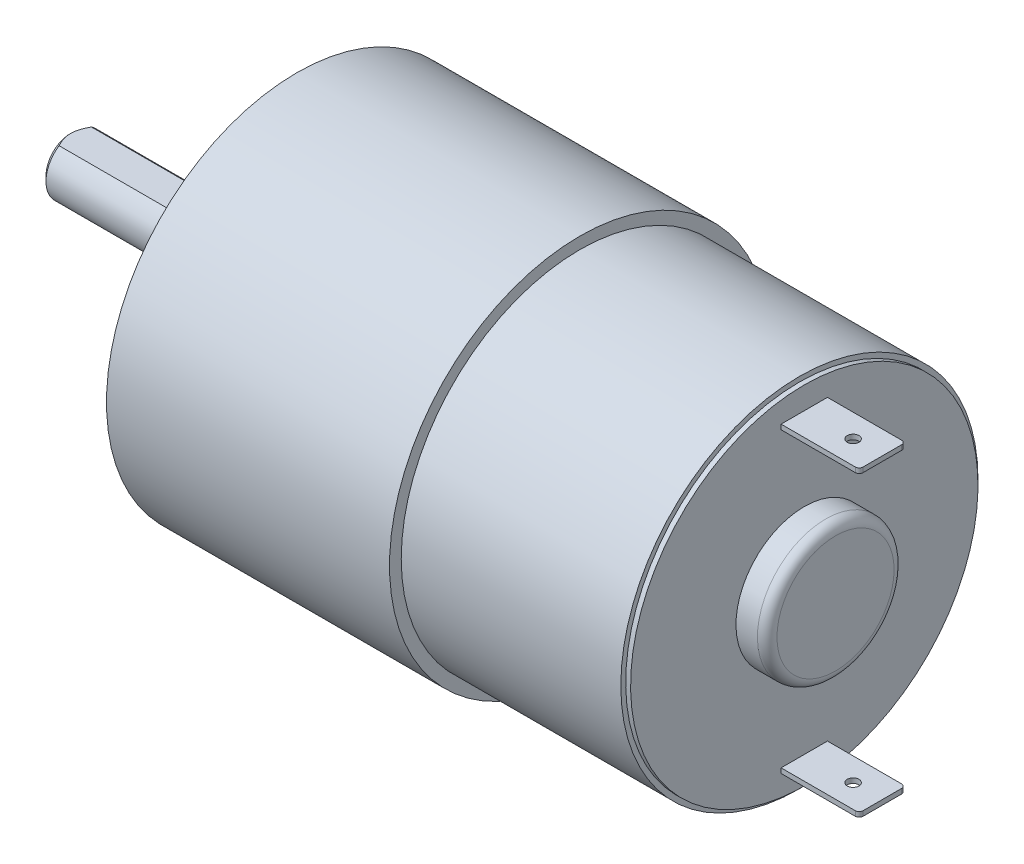
ISO-10303-21;
HEADER;
FILE_DESCRIPTION(('STEP AP214'),'2;1');
FILE_NAME('part.step','',(''),(''),'','','');
FILE_SCHEMA(('AUTOMOTIVE_DESIGN { 1 0 10303 214 1 1 1 1 }'));
ENDSEC;
DATA;
#1=APPLICATION_CONTEXT('core data for automotive mechanical design processes');
#2=APPLICATION_PROTOCOL_DEFINITION('international standard','automotive_design',2000,#1);
#3=PRODUCT_CONTEXT('',#1,'mechanical');
#4=PRODUCT('Part','Part','',(#3));
#5=PRODUCT_RELATED_PRODUCT_CATEGORY('part','',(#4));
#6=PRODUCT_DEFINITION_FORMATION('','',#4);
#7=PRODUCT_DEFINITION_CONTEXT('part definition',#1,'design');
#8=PRODUCT_DEFINITION('design','',#6,#7);
#9=PRODUCT_DEFINITION_SHAPE('','',#8);
#10=(LENGTH_UNIT() NAMED_UNIT(*) SI_UNIT(.MILLI.,.METRE.));
#11=(NAMED_UNIT(*) PLANE_ANGLE_UNIT() SI_UNIT($,.RADIAN.));
#12=(NAMED_UNIT(*) SI_UNIT($,.STERADIAN.) SOLID_ANGLE_UNIT());
#13=UNCERTAINTY_MEASURE_WITH_UNIT(LENGTH_MEASURE(1.E-05),#10,'distance_accuracy_value','');
#14=(GEOMETRIC_REPRESENTATION_CONTEXT(3) GLOBAL_UNCERTAINTY_ASSIGNED_CONTEXT((#13)) GLOBAL_UNIT_ASSIGNED_CONTEXT((#10,
#11,#12)) REPRESENTATION_CONTEXT('',''));
#15=CARTESIAN_POINT('',(0.,0.,0.));
#16=DIRECTION('',(0.,0.,1.));
#17=DIRECTION('',(1.,0.,0.));
#18=AXIS2_PLACEMENT_3D('',#15,#16,#17);
#19=CARTESIAN_POINT('',(0.,0.,0.));
#20=DIRECTION('',(-1.,0.,0.));
#21=DIRECTION('',(0.,-1.,0.));
#22=AXIS2_PLACEMENT_3D('',#19,#20,#21);
#23=PLANE('',#22);
#24=CARTESIAN_POINT('',(-5.6843418860808E-11,0.,0.));
#25=DIRECTION('',(1.,0.,0.));
#26=DIRECTION('',(0.,0.,-1.));
#27=AXIS2_PLACEMENT_3D('',#24,#25,#26);
#28=CIRCLE('',#27,2.50000000005457);
#29=CARTESIAN_POINT('',(-8.41271496909712E-11,2.50000000002729,0.));
#30=VERTEX_POINT('',#29);
#31=EDGE_CURVE('E171',#30,#30,#28,.T.);
#32=ORIENTED_EDGE('',*,*,#31,.F.);
#33=EDGE_LOOP('',(#32));
#34=FACE_BOUND('',#33,.T.);
#35=ADVANCED_FACE('F16',(#34),#23,.T.);
#36=CARTESIAN_POINT('',(0.49999999987449,0.,0.));
#37=DIRECTION('',(1.,0.,0.));
#38=DIRECTION('',(0.,0.,-1.));
#39=AXIS2_PLACEMENT_3D('',#36,#37,#38);
#40=CONICAL_SURFACE('',#39,2.9999999999859,0.785398163397448);
#41=CARTESIAN_POINT('',(-1.08961450973055E-10,2.49999999999409,0.));
#42=CARTESIAN_POINT('',(-6.43177486795808E-05,2.49999999999788,-0.076842839180518));
#43=CARTESIAN_POINT('',(0.00354143297495373,2.49999999999944,-0.153646619440515));
#44=CARTESIAN_POINT('',(0.0175861812727384,2.50000000000057,-0.306486913990931));
#45=CARTESIAN_POINT('',(0.028012243209482,2.50000000000015,-0.382524604614898));
#46=CARTESIAN_POINT('',(0.0549768112715763,2.49999999999985,-0.532231201598618));
#47=CARTESIAN_POINT('',(0.0714148650301511,2.49999999999996,-0.605918543015366));
#48=CARTESIAN_POINT('',(0.109672230239725,2.50000000000004,-0.751897163106947));
#49=CARTESIAN_POINT('',(0.131493639670987,2.50000000000001,-0.824187885624805));
#50=CARTESIAN_POINT('',(0.177758293321596,2.49999999999999,-0.961361204563494));
#51=CARTESIAN_POINT('',(0.201841837790338,2.5,-1.02636662587191));
#52=CARTESIAN_POINT('',(0.253302800658744,2.5,-1.1550556235711));
#53=CARTESIAN_POINT('',(0.280680360013409,2.5,-1.21873914325923));
#54=CARTESIAN_POINT('',(0.338654953810169,2.5,-1.34581351004464));
#55=CARTESIAN_POINT('',(0.369295480668299,2.5,-1.40918435965208));
#56=CARTESIAN_POINT('',(0.432964963796484,2.5,-1.53466113606442));
#57=CARTESIAN_POINT('',(0.46599220548214,2.5,-1.59676793063933));
#58=CARTESIAN_POINT('',(0.499999999913604,2.5,-1.65831239522295));
#59=B_SPLINE_CURVE_WITH_KNOTS('',3,(#41,#42,#43,#44,#45,#46,#47,#48,#49,#50,#51,#52,#53,#54,#55,
#56,#57,#58),.UNSPECIFIED.,.F.,.F.,(4,2,2,2,2,2,2,2,4),(0.,0.230381722715328,0.460327757459506,
0.686595219702922,0.912951001700784,1.12081935765768,1.32869661172609,1.53981070706892,
1.7507746202842),.UNSPECIFIED.);
#60=CARTESIAN_POINT('',(0.49999999995734,2.5,-1.65831239520128));
#61=VERTEX_POINT('',#60);
#62=EDGE_CURVE('E181',#30,#61,#59,.T.);
#63=ORIENTED_EDGE('',*,*,#62,.T.);
#64=CARTESIAN_POINT('',(0.500000000000014,0.,0.));
#65=DIRECTION('',(1.,0.,0.));
#66=DIRECTION('',(0.,1.,0.));
#67=AXIS2_PLACEMENT_3D('',#64,#65,#66);
#68=CIRCLE('',#67,3.);
#69=CARTESIAN_POINT('',(0.49999999995734,2.5,1.65831239520128));
#70=VERTEX_POINT('',#69);
#71=EDGE_CURVE('E166',#70,#61,#68,.T.);
#72=ORIENTED_EDGE('',*,*,#71,.F.);
#73=CARTESIAN_POINT('',(0.499999999925227,2.49999999997626,1.65831239521903));
#74=CARTESIAN_POINT('',(0.474979974333369,2.49999999999125,1.61304419075708));
#75=CARTESIAN_POINT('',(0.45050057269507,2.49999999999761,1.56747781755556));
#76=CARTESIAN_POINT('',(0.40279031317973,2.5000000000024,1.47571363159524));
#77=CARTESIAN_POINT('',(0.379559096032034,2.50000000000084,1.42951600538723));
#78=CARTESIAN_POINT('',(0.311766258440834,2.49999999999832,1.2894689825457));
#79=CARTESIAN_POINT('',(0.269331446407607,2.49999999999956,1.19456817299876));
#80=CARTESIAN_POINT('',(0.192835868545321,2.50000000000043,1.00435832665082));
#81=CARTESIAN_POINT('',(0.158581406665273,2.50000000000012,0.909128166895885));
#82=CARTESIAN_POINT('',(0.0988813615530537,2.49999999999989,0.715960996439603));
#83=CARTESIAN_POINT('',(0.0734294785928917,2.49999999999997,0.618025975952468));
#84=CARTESIAN_POINT('',(0.036048583753439,2.50000000000003,0.43409653106737));
#85=CARTESIAN_POINT('',(0.0227071005608561,2.50000000000001,0.348395131944211));
#86=CARTESIAN_POINT('',(0.00917334555979382,2.5,0.218706232986137));
#87=CARTESIAN_POINT('',(0.00574117932389647,2.5,0.175042274899419));
#88=CARTESIAN_POINT('',(0.00115154514745591,2.5,0.0875881850281385));
#89=CARTESIAN_POINT('',(-5.55031791566704E-06,2.5,0.0437980337582923));
#90=CARTESIAN_POINT('',(-1.11410880521134E-10,2.5,4.96130914129367E-13));
#91=B_SPLINE_CURVE_WITH_KNOTS('',3,(#73,#74,#75,#76,#77,#78,#79,#80,#81,#82,#83,#84,#85,#86,#87,
#88,#89,#90),.UNSPECIFIED.,.F.,.F.,(4,2,2,2,2,2,2,2,4),(0.,0.155160114664255,0.310275326959197,
0.621889187477608,0.925164565319454,1.22822244722021,1.48798349656647,1.61932602452163,
1.75069005411929),.UNSPECIFIED.);
#92=EDGE_CURVE('E174',#70,#30,#91,.T.);
#93=ORIENTED_EDGE('',*,*,#92,.T.);
#94=ORIENTED_EDGE('',*,*,#31,.T.);
#95=EDGE_LOOP('',(#63,#72,#93,#94));
#96=FACE_BOUND('',#95,.T.);
#97=ADVANCED_FACE('F176',(#96),#40,.T.);
#98=CARTESIAN_POINT('',(12.,2.5,-1.65831239517769));
#99=DIRECTION('',(0.,-1.,0.));
#100=DIRECTION('',(1.,0.,0.));
#101=AXIS2_PLACEMENT_3D('',#98,#99,#100);
#102=PLANE('',#101);
#103=ORIENTED_EDGE('',*,*,#62,.F.);
#104=ORIENTED_EDGE('',*,*,#92,.F.);
#105=DIRECTION('',(1.,0.,0.));
#106=VECTOR('',#105,1.);
#107=CARTESIAN_POINT('',(78.4,2.5,1.65831239517769));
#108=LINE('',#107,#106);
#109=CARTESIAN_POINT('',(12.,2.5,1.65831239517768));
#110=VERTEX_POINT('',#109);
#111=EDGE_CURVE('E413',#110,#70,#108,.F.);
#112=ORIENTED_EDGE('',*,*,#111,.F.);
#113=DIRECTION('',(0.,0.,1.));
#114=VECTOR('',#113,1.);
#115=CARTESIAN_POINT('',(12.,2.5,0.));
#116=LINE('',#115,#114);
#117=CARTESIAN_POINT('',(12.,2.5,-1.65831239517769));
#118=VERTEX_POINT('',#117);
#119=EDGE_CURVE('E186',#110,#118,#116,.F.);
#120=ORIENTED_EDGE('',*,*,#119,.T.);
#121=DIRECTION('',(1.,0.,0.));
#122=VECTOR('',#121,1.);
#123=CARTESIAN_POINT('',(78.4,2.5,-1.65831239517769));
#124=LINE('',#123,#122);
#125=EDGE_CURVE('E414',#61,#118,#124,.T.);
#126=ORIENTED_EDGE('',*,*,#125,.F.);
#127=EDGE_LOOP('',(#103,#104,#112,#120,#126));
#128=FACE_BOUND('',#127,.T.);
#129=ADVANCED_FACE('F198',(#128),#102,.F.);
#130=CARTESIAN_POINT('',(12.,0.,0.));
#131=DIRECTION('',(1.,0.,0.));
#132=DIRECTION('',(0.,1.,0.));
#133=AXIS2_PLACEMENT_3D('',#130,#131,#132);
#134=PLANE('',#133);
#135=CARTESIAN_POINT('',(12.,0.,0.));
#136=DIRECTION('',(1.,0.,0.));
#137=DIRECTION('',(0.,1.,0.));
#138=AXIS2_PLACEMENT_3D('',#135,#136,#137);
#139=CIRCLE('',#138,3.);
#140=EDGE_CURVE('E418',#118,#110,#139,.T.);
#141=ORIENTED_EDGE('',*,*,#140,.F.);
#142=ORIENTED_EDGE('',*,*,#119,.F.);
#143=EDGE_LOOP('',(#141,#142));
#144=FACE_BOUND('',#143,.T.);
#145=ADVANCED_FACE('F209',(#144),#134,.F.);
#146=CARTESIAN_POINT('',(78.4,0.,0.));
#147=DIRECTION('',(1.,0.,0.));
#148=DIRECTION('',(0.,1.,0.));
#149=AXIS2_PLACEMENT_3D('',#146,#147,#148);
#150=CYLINDRICAL_SURFACE('',#149,3.);
#151=ORIENTED_EDGE('',*,*,#111,.T.);
#152=ORIENTED_EDGE('',*,*,#71,.T.);
#153=ORIENTED_EDGE('',*,*,#125,.T.);
#154=ORIENTED_EDGE('',*,*,#140,.T.);
#155=EDGE_LOOP('',(#151,#152,#153,#154));
#156=FACE_BOUND('',#155,.T.);
#157=CARTESIAN_POINT('',(15.,0.,0.));
#158=DIRECTION('',(1.,0.,0.));
#159=DIRECTION('',(0.,1.,0.));
#160=AXIS2_PLACEMENT_3D('',#157,#158,#159);
#161=CIRCLE('',#160,3.);
#162=CARTESIAN_POINT('',(15.,3.,0.));
#163=VERTEX_POINT('',#162);
#164=EDGE_CURVE('E539',#163,#163,#161,.T.);
#165=ORIENTED_EDGE('',*,*,#164,.F.);
#166=EDGE_LOOP('',(#165));
#167=FACE_BOUND('',#166,.T.);
#168=ADVANCED_FACE('F391',(#156,#167),#150,.T.);
#169=CARTESIAN_POINT('',(78.4,6.99999999999999,0.));
#170=DIRECTION('',(1.,0.,0.));
#171=DIRECTION('',(0.,1.,0.));
#172=AXIS2_PLACEMENT_3D('',#169,#170,#171);
#173=PLANE('',#172);
#174=CARTESIAN_POINT('',(78.4,0.,0.));
#175=DIRECTION('',(-1.,0.,0.));
#176=DIRECTION('',(0.,-1.,0.));
#177=AXIS2_PLACEMENT_3D('',#174,#175,#176);
#178=CIRCLE('',#177,6.00000000000001);
#179=CARTESIAN_POINT('',(78.4,-6.00000000000001,0.));
#180=VERTEX_POINT('',#179);
#181=CARTESIAN_POINT('',(78.4,6.00000000000001,0.));
#182=VERTEX_POINT('',#181);
#183=EDGE_CURVE('E376',#180,#182,#178,.T.);
#184=ORIENTED_EDGE('',*,*,#183,.F.);
#185=CARTESIAN_POINT('',(78.4,0.,0.));
#186=DIRECTION('',(-1.,0.,0.));
#187=DIRECTION('',(0.,1.,0.));
#188=AXIS2_PLACEMENT_3D('',#185,#186,#187);
#189=CIRCLE('',#188,6.00000000000001);
#190=EDGE_CURVE('E402',#182,#180,#189,.T.);
#191=ORIENTED_EDGE('',*,*,#190,.F.);
#192=EDGE_LOOP('',(#184,#191));
#193=FACE_BOUND('',#192,.T.);
#194=ADVANCED_FACE('F382',(#193),#173,.T.);
#195=CARTESIAN_POINT('',(15.,2.99999999999999,0.));
#196=DIRECTION('',(-1.,0.,0.));
#197=DIRECTION('',(0.,-1.,0.));
#198=AXIS2_PLACEMENT_3D('',#195,#196,#197);
#199=PLANE('',#198);
#200=CARTESIAN_POINT('',(15.,0.,0.));
#201=DIRECTION('',(1.,0.,0.));
#202=DIRECTION('',(0.,1.,0.));
#203=AXIS2_PLACEMENT_3D('',#200,#201,#202);
#204=CIRCLE('',#203,5.99999999999999);
#205=CARTESIAN_POINT('',(15.,5.99999999999999,0.));
#206=VERTEX_POINT('',#205);
#207=EDGE_CURVE('E372',#206,#206,#204,.T.);
#208=ORIENTED_EDGE('',*,*,#207,.F.);
#209=EDGE_LOOP('',(#208));
#210=FACE_BOUND('',#209,.T.);
#211=ORIENTED_EDGE('',*,*,#164,.T.);
#212=EDGE_LOOP('',(#211));
#213=FACE_BOUND('',#212,.T.);
#214=ADVANCED_FACE('F357',(#210,#213),#199,.T.);
#215=CARTESIAN_POINT('',(77.4,0.,0.));
#216=DIRECTION('',(1.,0.,0.));
#217=DIRECTION('',(0.,1.,0.));
#218=AXIS2_PLACEMENT_3D('',#215,#216,#217);
#219=TOROIDAL_SURFACE('',#218,6.00000000000001,1.);
#220=CARTESIAN_POINT('',(77.4,0.,0.));
#221=DIRECTION('',(1.,0.,0.));
#222=DIRECTION('',(0.,1.,0.));
#223=AXIS2_PLACEMENT_3D('',#220,#221,#222);
#224=CIRCLE('',#223,7.);
#225=CARTESIAN_POINT('',(77.4,7.,0.));
#226=VERTEX_POINT('',#225);
#227=EDGE_CURVE('E367',#226,#226,#224,.F.);
#228=ORIENTED_EDGE('',*,*,#227,.F.);
#229=EDGE_LOOP('',(#228));
#230=FACE_BOUND('',#229,.T.);
#231=ORIENTED_EDGE('',*,*,#190,.T.);
#232=ORIENTED_EDGE('',*,*,#183,.T.);
#233=EDGE_LOOP('',(#231,#232));
#234=FACE_BOUND('',#233,.T.);
#235=ADVANCED_FACE('F351',(#230,#234),#219,.T.);
#236=CARTESIAN_POINT('',(80.2,-19.5,0.));
#237=DIRECTION('',(0.,1.,0.));
#238=DIRECTION('',(-1.,0.,0.));
#239=AXIS2_PLACEMENT_3D('',#236,#237,#238);
#240=CYLINDRICAL_SURFACE('',#239,0.600000000000003);
#241=CARTESIAN_POINT('',(80.2,15.,0.));
#242=DIRECTION('',(0.,1.,0.));
#243=DIRECTION('',(-1.,0.,0.));
#244=AXIS2_PLACEMENT_3D('',#241,#242,#243);
#245=CIRCLE('',#244,0.600000000000003);
#246=CARTESIAN_POINT('',(79.6,15.,0.));
#247=VERTEX_POINT('',#246);
#248=EDGE_CURVE('E371',#247,#247,#245,.F.);
#249=ORIENTED_EDGE('',*,*,#248,.T.);
#250=EDGE_LOOP('',(#249));
#251=FACE_BOUND('',#250,.T.);
#252=CARTESIAN_POINT('',(80.2,15.5,0.));
#253=DIRECTION('',(0.,1.,0.));
#254=DIRECTION('',(-1.,0.,0.));
#255=AXIS2_PLACEMENT_3D('',#252,#253,#254);
#256=CIRCLE('',#255,0.600000000000003);
#257=CARTESIAN_POINT('',(79.6,15.5,0.));
#258=VERTEX_POINT('',#257);
#259=EDGE_CURVE('E518',#258,#258,#256,.T.);
#260=ORIENTED_EDGE('',*,*,#259,.T.);
#261=EDGE_LOOP('',(#260));
#262=FACE_BOUND('',#261,.T.);
#263=ADVANCED_FACE('F348',(#251,#262),#240,.F.);
#264=CARTESIAN_POINT('',(82.8,0.,1.97499999999999));
#265=DIRECTION('',(0.,1.,0.));
#266=DIRECTION('',(0.,0.,1.));
#267=AXIS2_PLACEMENT_3D('',#264,#265,#266);
#268=CYLINDRICAL_SURFACE('',#267,0.4);
#269=CARTESIAN_POINT('',(82.8,15.,1.975));
#270=DIRECTION('',(0.,1.,0.));
#271=DIRECTION('',(0.,0.,1.));
#272=AXIS2_PLACEMENT_3D('',#269,#270,#271);
#273=CIRCLE('',#272,0.4);
#274=CARTESIAN_POINT('',(82.8,15.,2.375));
#275=VERTEX_POINT('',#274);
#276=CARTESIAN_POINT('',(83.2,15.,1.975));
#277=VERTEX_POINT('',#276);
#278=EDGE_CURVE('E528',#275,#277,#273,.T.);
#279=ORIENTED_EDGE('',*,*,#278,.T.);
#280=DIRECTION('',(0.,1.,0.));
#281=VECTOR('',#280,1.);
#282=CARTESIAN_POINT('',(83.2,0.,1.975));
#283=LINE('',#282,#281);
#284=CARTESIAN_POINT('',(83.2,15.5,1.975));
#285=VERTEX_POINT('',#284);
#286=EDGE_CURVE('E822',#285,#277,#283,.F.);
#287=ORIENTED_EDGE('',*,*,#286,.F.);
#288=CARTESIAN_POINT('',(82.8,15.5,1.975));
#289=DIRECTION('',(0.,1.,0.));
#290=DIRECTION('',(0.,0.,1.));
#291=AXIS2_PLACEMENT_3D('',#288,#289,#290);
#292=CIRCLE('',#291,0.4);
#293=CARTESIAN_POINT('',(82.8,15.5,2.375));
#294=VERTEX_POINT('',#293);
#295=EDGE_CURVE('E514',#285,#294,#292,.F.);
#296=ORIENTED_EDGE('',*,*,#295,.T.);
#297=DIRECTION('',(0.,1.,0.));
#298=VECTOR('',#297,1.);
#299=CARTESIAN_POINT('',(82.8,15.5,2.375));
#300=LINE('',#299,#298);
#301=EDGE_CURVE('E888',#294,#275,#300,.F.);
#302=ORIENTED_EDGE('',*,*,#301,.T.);
#303=EDGE_LOOP('',(#279,#287,#296,#302));
#304=FACE_BOUND('',#303,.T.);
#305=ADVANCED_FACE('F344',(#304),#268,.T.);
#306=CARTESIAN_POINT('',(83.2,15.5,2.375));
#307=DIRECTION('',(0.,0.,-1.));
#308=DIRECTION('',(0.,1.,0.));
#309=AXIS2_PLACEMENT_3D('',#306,#307,#308);
#310=PLANE('',#309);
#311=ORIENTED_EDGE('',*,*,#301,.F.);
#312=DIRECTION('',(1.,0.,0.));
#313=VECTOR('',#312,1.);
#314=CARTESIAN_POINT('',(83.2,15.5,2.375));
#315=LINE('',#314,#313);
#316=CARTESIAN_POINT('',(75.2,15.5,2.375));
#317=VERTEX_POINT('',#316);
#318=EDGE_CURVE('E517',#294,#317,#315,.F.);
#319=ORIENTED_EDGE('',*,*,#318,.T.);
#320=DIRECTION('',(0.,1.,0.));
#321=VECTOR('',#320,1.);
#322=CARTESIAN_POINT('',(75.2,15.5,2.375));
#323=LINE('',#322,#321);
#324=CARTESIAN_POINT('',(75.2,15.,2.375));
#325=VERTEX_POINT('',#324);
#326=EDGE_CURVE('E898',#325,#317,#323,.T.);
#327=ORIENTED_EDGE('',*,*,#326,.F.);
#328=DIRECTION('',(-1.,0.,0.));
#329=VECTOR('',#328,1.);
#330=CARTESIAN_POINT('',(83.2,15.,2.375));
#331=LINE('',#330,#329);
#332=EDGE_CURVE('E531',#325,#275,#331,.F.);
#333=ORIENTED_EDGE('',*,*,#332,.T.);
#334=EDGE_LOOP('',(#311,#319,#327,#333));
#335=FACE_BOUND('',#334,.T.);
#336=ADVANCED_FACE('F340',(#335),#310,.F.);
#337=CARTESIAN_POINT('',(83.2,15.5,-2.375));
#338=DIRECTION('',(0.,0.,1.));
#339=DIRECTION('',(0.,-1.,0.));
#340=AXIS2_PLACEMENT_3D('',#337,#338,#339);
#341=PLANE('',#340);
#342=DIRECTION('',(0.,-1.,0.));
#343=VECTOR('',#342,1.);
#344=CARTESIAN_POINT('',(82.8,0.,-2.37499999999999));
#345=LINE('',#344,#343);
#346=CARTESIAN_POINT('',(82.8,15.,-2.375));
#347=VERTEX_POINT('',#346);
#348=CARTESIAN_POINT('',(82.8,15.5,-2.375));
#349=VERTEX_POINT('',#348);
#350=EDGE_CURVE('E878',#347,#349,#345,.F.);
#351=ORIENTED_EDGE('',*,*,#350,.F.);
#352=DIRECTION('',(-1.,0.,0.));
#353=VECTOR('',#352,1.);
#354=CARTESIAN_POINT('',(83.2,15.,-2.375));
#355=LINE('',#354,#353);
#356=CARTESIAN_POINT('',(75.2,15.,-2.375));
#357=VERTEX_POINT('',#356);
#358=EDGE_CURVE('E522',#347,#357,#355,.T.);
#359=ORIENTED_EDGE('',*,*,#358,.T.);
#360=DIRECTION('',(0.,-1.,0.));
#361=VECTOR('',#360,1.);
#362=CARTESIAN_POINT('',(75.2,15.5,-2.375));
#363=LINE('',#362,#361);
#364=CARTESIAN_POINT('',(75.2,15.5,-2.375));
#365=VERTEX_POINT('',#364);
#366=EDGE_CURVE('E885',#365,#357,#363,.T.);
#367=ORIENTED_EDGE('',*,*,#366,.F.);
#368=DIRECTION('',(1.,0.,0.));
#369=VECTOR('',#368,1.);
#370=CARTESIAN_POINT('',(83.2,15.5,-2.375));
#371=LINE('',#370,#369);
#372=EDGE_CURVE('E513',#365,#349,#371,.T.);
#373=ORIENTED_EDGE('',*,*,#372,.T.);
#374=EDGE_LOOP('',(#351,#359,#367,#373));
#375=FACE_BOUND('',#374,.T.);
#376=ADVANCED_FACE('F336',(#375),#341,.F.);
#377=CARTESIAN_POINT('',(82.8,0.,-1.97499999999999));
#378=DIRECTION('',(0.,-1.,0.));
#379=DIRECTION('',(0.,0.,-1.));
#380=AXIS2_PLACEMENT_3D('',#377,#378,#379);
#381=CYLINDRICAL_SURFACE('',#380,0.4);
#382=CARTESIAN_POINT('',(82.8,15.5,-1.975));
#383=DIRECTION('',(0.,-1.,0.));
#384=DIRECTION('',(0.,0.,-1.));
#385=AXIS2_PLACEMENT_3D('',#382,#383,#384);
#386=CIRCLE('',#385,0.4);
#387=CARTESIAN_POINT('',(83.2,15.5,-1.975));
#388=VERTEX_POINT('',#387);
#389=EDGE_CURVE('E510',#349,#388,#386,.T.);
#390=ORIENTED_EDGE('',*,*,#389,.T.);
#391=DIRECTION('',(0.,1.,0.));
#392=VECTOR('',#391,1.);
#393=CARTESIAN_POINT('',(83.2,0.,-1.975));
#394=LINE('',#393,#392);
#395=CARTESIAN_POINT('',(83.2,15.,-1.975));
#396=VERTEX_POINT('',#395);
#397=EDGE_CURVE('E874',#396,#388,#394,.T.);
#398=ORIENTED_EDGE('',*,*,#397,.F.);
#399=CARTESIAN_POINT('',(82.8,15.,-1.975));
#400=DIRECTION('',(0.,-1.,0.));
#401=DIRECTION('',(0.,0.,-1.));
#402=AXIS2_PLACEMENT_3D('',#399,#400,#401);
#403=CIRCLE('',#402,0.4);
#404=EDGE_CURVE('E523',#396,#347,#403,.F.);
#405=ORIENTED_EDGE('',*,*,#404,.T.);
#406=ORIENTED_EDGE('',*,*,#350,.T.);
#407=EDGE_LOOP('',(#390,#398,#405,#406));
#408=FACE_BOUND('',#407,.T.);
#409=ADVANCED_FACE('F332',(#408),#381,.T.);
#410=CARTESIAN_POINT('',(83.2,0.,0.));
#411=DIRECTION('',(1.,0.,0.));
#412=DIRECTION('',(0.,0.,-1.));
#413=AXIS2_PLACEMENT_3D('',#410,#411,#412);
#414=PLANE('',#413);
#415=DIRECTION('',(0.,0.,1.));
#416=VECTOR('',#415,1.);
#417=CARTESIAN_POINT('',(83.2,15.5,2.375));
#418=LINE('',#417,#416);
#419=EDGE_CURVE('E509',#388,#285,#418,.T.);
#420=ORIENTED_EDGE('',*,*,#419,.T.);
#421=ORIENTED_EDGE('',*,*,#286,.T.);
#422=DIRECTION('',(0.,0.,1.));
#423=VECTOR('',#422,1.);
#424=CARTESIAN_POINT('',(83.2,15.,2.375));
#425=LINE('',#424,#423);
#426=EDGE_CURVE('E527',#277,#396,#425,.F.);
#427=ORIENTED_EDGE('',*,*,#426,.T.);
#428=ORIENTED_EDGE('',*,*,#397,.T.);
#429=EDGE_LOOP('',(#420,#421,#427,#428));
#430=FACE_BOUND('',#429,.T.);
#431=ADVANCED_FACE('F328',(#430),#414,.T.);
#432=CARTESIAN_POINT('',(80.2,-19.5,0.));
#433=DIRECTION('',(0.,1.,0.));
#434=DIRECTION('',(-1.,0.,0.));
#435=AXIS2_PLACEMENT_3D('',#432,#433,#434);
#436=CYLINDRICAL_SURFACE('',#435,0.600000000000003);
#437=CARTESIAN_POINT('',(80.2,-15.,0.));
#438=DIRECTION('',(0.,1.,0.));
#439=DIRECTION('',(-1.,0.,0.));
#440=AXIS2_PLACEMENT_3D('',#437,#438,#439);
#441=CIRCLE('',#440,0.600000000000003);
#442=CARTESIAN_POINT('',(79.6,-15.,0.));
#443=VERTEX_POINT('',#442);
#444=EDGE_CURVE('E491',#443,#443,#441,.T.);
#445=ORIENTED_EDGE('',*,*,#444,.T.);
#446=EDGE_LOOP('',(#445));
#447=FACE_BOUND('',#446,.T.);
#448=CARTESIAN_POINT('',(80.2,-15.5,0.));
#449=DIRECTION('',(0.,1.,0.));
#450=DIRECTION('',(-1.,0.,0.));
#451=AXIS2_PLACEMENT_3D('',#448,#449,#450);
#452=CIRCLE('',#451,0.600000000000003);
#453=CARTESIAN_POINT('',(79.6,-15.5,0.));
#454=VERTEX_POINT('',#453);
#455=EDGE_CURVE('E505',#454,#454,#452,.F.);
#456=ORIENTED_EDGE('',*,*,#455,.T.);
#457=EDGE_LOOP('',(#456));
#458=FACE_BOUND('',#457,.T.);
#459=ADVANCED_FACE('F324',(#447,#458),#436,.F.);
#460=CARTESIAN_POINT('',(82.8,0.,1.975));
#461=DIRECTION('',(0.,1.,0.));
#462=DIRECTION('',(0.,0.,1.));
#463=AXIS2_PLACEMENT_3D('',#460,#461,#462);
#464=CYLINDRICAL_SURFACE('',#463,0.4);
#465=CARTESIAN_POINT('',(82.8,-15.5,1.97500000000001));
#466=DIRECTION('',(0.,1.,0.));
#467=DIRECTION('',(0.,0.,1.));
#468=AXIS2_PLACEMENT_3D('',#465,#466,#467);
#469=CIRCLE('',#468,0.4);
#470=CARTESIAN_POINT('',(82.8,-15.5,2.37500000000001));
#471=VERTEX_POINT('',#470);
#472=CARTESIAN_POINT('',(83.2,-15.5,1.97500000000001));
#473=VERTEX_POINT('',#472);
#474=EDGE_CURVE('E501',#471,#473,#469,.T.);
#475=ORIENTED_EDGE('',*,*,#474,.T.);
#476=DIRECTION('',(0.,1.,0.));
#477=VECTOR('',#476,1.);
#478=CARTESIAN_POINT('',(83.2,0.,1.97500000000001));
#479=LINE('',#478,#477);
#480=CARTESIAN_POINT('',(83.2,-15.,1.97500000000001));
#481=VERTEX_POINT('',#480);
#482=EDGE_CURVE('E538',#481,#473,#479,.F.);
#483=ORIENTED_EDGE('',*,*,#482,.F.);
#484=CARTESIAN_POINT('',(82.8,-15.,1.97500000000001));
#485=DIRECTION('',(0.,1.,0.));
#486=DIRECTION('',(0.,0.,1.));
#487=AXIS2_PLACEMENT_3D('',#484,#485,#486);
#488=CIRCLE('',#487,0.4);
#489=CARTESIAN_POINT('',(82.8,-15.,2.37500000000001));
#490=VERTEX_POINT('',#489);
#491=EDGE_CURVE('E487',#481,#490,#488,.F.);
#492=ORIENTED_EDGE('',*,*,#491,.T.);
#493=DIRECTION('',(0.,1.,0.));
#494=VECTOR('',#493,1.);
#495=CARTESIAN_POINT('',(82.8,-15.5,2.37500000000001));
#496=LINE('',#495,#494);
#497=EDGE_CURVE('E821',#490,#471,#496,.F.);
#498=ORIENTED_EDGE('',*,*,#497,.T.);
#499=EDGE_LOOP('',(#475,#483,#492,#498));
#500=FACE_BOUND('',#499,.T.);
#501=ADVANCED_FACE('F320',(#500),#464,.T.);
#502=CARTESIAN_POINT('',(83.2,-15.5,2.37500000000001));
#503=DIRECTION('',(0.,0.,-1.));
#504=DIRECTION('',(0.,1.,0.));
#505=AXIS2_PLACEMENT_3D('',#502,#503,#504);
#506=PLANE('',#505);
#507=ORIENTED_EDGE('',*,*,#497,.F.);
#508=DIRECTION('',(1.,0.,0.));
#509=VECTOR('',#508,1.);
#510=CARTESIAN_POINT('',(83.2,-15.,2.37500000000001));
#511=LINE('',#510,#509);
#512=CARTESIAN_POINT('',(75.2,-15.,2.37500000000001));
#513=VERTEX_POINT('',#512);
#514=EDGE_CURVE('E490',#490,#513,#511,.F.);
#515=ORIENTED_EDGE('',*,*,#514,.T.);
#516=DIRECTION('',(0.,1.,0.));
#517=VECTOR('',#516,1.);
#518=CARTESIAN_POINT('',(75.2,-15.5,2.37500000000001));
#519=LINE('',#518,#517);
#520=CARTESIAN_POINT('',(75.2,-15.5,2.37500000000001));
#521=VERTEX_POINT('',#520);
#522=EDGE_CURVE('E819',#521,#513,#519,.T.);
#523=ORIENTED_EDGE('',*,*,#522,.F.);
#524=DIRECTION('',(-1.,0.,0.));
#525=VECTOR('',#524,1.);
#526=CARTESIAN_POINT('',(83.2,-15.5,2.37500000000001));
#527=LINE('',#526,#525);
#528=EDGE_CURVE('E504',#521,#471,#527,.F.);
#529=ORIENTED_EDGE('',*,*,#528,.T.);
#530=EDGE_LOOP('',(#507,#515,#523,#529));
#531=FACE_BOUND('',#530,.T.);
#532=ADVANCED_FACE('F316',(#531),#506,.F.);
#533=CARTESIAN_POINT('',(83.2,-15.5,-2.37499999999999));
#534=DIRECTION('',(0.,0.,1.));
#535=DIRECTION('',(0.,-1.,0.));
#536=AXIS2_PLACEMENT_3D('',#533,#534,#535);
#537=PLANE('',#536);
#538=DIRECTION('',(0.,-1.,0.));
#539=VECTOR('',#538,1.);
#540=CARTESIAN_POINT('',(82.8,0.,-2.37499999999997));
#541=LINE('',#540,#539);
#542=CARTESIAN_POINT('',(82.8,-15.5,-2.37499999999999));
#543=VERTEX_POINT('',#542);
#544=CARTESIAN_POINT('',(82.8,-15.,-2.37499999999998));
#545=VERTEX_POINT('',#544);
#546=EDGE_CURVE('E835',#543,#545,#541,.F.);
#547=ORIENTED_EDGE('',*,*,#546,.F.);
#548=DIRECTION('',(-1.,0.,0.));
#549=VECTOR('',#548,1.);
#550=CARTESIAN_POINT('',(83.2,-15.5,-2.37499999999999));
#551=LINE('',#550,#549);
#552=CARTESIAN_POINT('',(75.2,-15.5,-2.37499999999999));
#553=VERTEX_POINT('',#552);
#554=EDGE_CURVE('E495',#543,#553,#551,.T.);
#555=ORIENTED_EDGE('',*,*,#554,.T.);
#556=DIRECTION('',(0.,-1.,0.));
#557=VECTOR('',#556,1.);
#558=CARTESIAN_POINT('',(75.2,-15.5,-2.37499999999999));
#559=LINE('',#558,#557);
#560=CARTESIAN_POINT('',(75.2,-15.,-2.37499999999998));
#561=VERTEX_POINT('',#560);
#562=EDGE_CURVE('E833',#561,#553,#559,.T.);
#563=ORIENTED_EDGE('',*,*,#562,.F.);
#564=DIRECTION('',(1.,0.,0.));
#565=VECTOR('',#564,1.);
#566=CARTESIAN_POINT('',(83.2,-15.,-2.37499999999998));
#567=LINE('',#566,#565);
#568=EDGE_CURVE('E486',#561,#545,#567,.T.);
#569=ORIENTED_EDGE('',*,*,#568,.T.);
#570=EDGE_LOOP('',(#547,#555,#563,#569));
#571=FACE_BOUND('',#570,.T.);
#572=ADVANCED_FACE('F312',(#571),#537,.F.);
#573=CARTESIAN_POINT('',(82.8,0.,-1.97499999999997));
#574=DIRECTION('',(0.,-1.,0.));
#575=DIRECTION('',(0.,0.,-1.));
#576=AXIS2_PLACEMENT_3D('',#573,#574,#575);
#577=CYLINDRICAL_SURFACE('',#576,0.4);
#578=CARTESIAN_POINT('',(82.8,-15.,-1.97499999999998));
#579=DIRECTION('',(0.,-1.,0.));
#580=DIRECTION('',(0.,0.,-1.));
#581=AXIS2_PLACEMENT_3D('',#578,#579,#580);
#582=CIRCLE('',#581,0.4);
#583=CARTESIAN_POINT('',(83.2,-15.,-1.97499999999999));
#584=VERTEX_POINT('',#583);
#585=EDGE_CURVE('E483',#545,#584,#582,.T.);
#586=ORIENTED_EDGE('',*,*,#585,.T.);
#587=DIRECTION('',(0.,1.,0.));
#588=VECTOR('',#587,1.);
#589=CARTESIAN_POINT('',(83.2,0.,-1.97499999999999));
#590=LINE('',#589,#588);
#591=CARTESIAN_POINT('',(83.2,-15.5,-1.97499999999999));
#592=VERTEX_POINT('',#591);
#593=EDGE_CURVE('E845',#592,#584,#590,.T.);
#594=ORIENTED_EDGE('',*,*,#593,.F.);
#595=CARTESIAN_POINT('',(82.8,-15.5,-1.97499999999999));
#596=DIRECTION('',(0.,-1.,0.));
#597=DIRECTION('',(0.,0.,-1.));
#598=AXIS2_PLACEMENT_3D('',#595,#596,#597);
#599=CIRCLE('',#598,0.4);
#600=EDGE_CURVE('E496',#592,#543,#599,.F.);
#601=ORIENTED_EDGE('',*,*,#600,.T.);
#602=ORIENTED_EDGE('',*,*,#546,.T.);
#603=EDGE_LOOP('',(#586,#594,#601,#602));
#604=FACE_BOUND('',#603,.T.);
#605=ADVANCED_FACE('F308',(#604),#577,.T.);
#606=CARTESIAN_POINT('',(83.2,0.,0.));
#607=DIRECTION('',(1.,0.,0.));
#608=DIRECTION('',(0.,0.,-1.));
#609=AXIS2_PLACEMENT_3D('',#606,#607,#608);
#610=PLANE('',#609);
#611=DIRECTION('',(0.,0.,1.));
#612=VECTOR('',#611,1.);
#613=CARTESIAN_POINT('',(83.2,-15.,2.37500000000001));
#614=LINE('',#613,#612);
#615=EDGE_CURVE('E482',#584,#481,#614,.T.);
#616=ORIENTED_EDGE('',*,*,#615,.T.);
#617=ORIENTED_EDGE('',*,*,#482,.T.);
#618=DIRECTION('',(0.,0.,1.));
#619=VECTOR('',#618,1.);
#620=CARTESIAN_POINT('',(83.2,-15.5,2.37500000000001));
#621=LINE('',#620,#619);
#622=EDGE_CURVE('E500',#473,#592,#621,.F.);
#623=ORIENTED_EDGE('',*,*,#622,.T.);
#624=ORIENTED_EDGE('',*,*,#593,.T.);
#625=EDGE_LOOP('',(#616,#617,#623,#624));
#626=FACE_BOUND('',#625,.T.);
#627=ADVANCED_FACE('F304',(#626),#610,.T.);
#628=CARTESIAN_POINT('',(78.4,0.,0.));
#629=DIRECTION('',(1.,0.,0.));
#630=DIRECTION('',(0.,1.,0.));
#631=AXIS2_PLACEMENT_3D('',#628,#629,#630);
#632=CYLINDRICAL_SURFACE('',#631,5.99999999999999);
#633=ORIENTED_EDGE('',*,*,#207,.T.);
#634=EDGE_LOOP('',(#633));
#635=FACE_BOUND('',#634,.T.);
#636=CARTESIAN_POINT('',(17.2,0.,0.));
#637=DIRECTION('',(1.,0.,0.));
#638=DIRECTION('',(0.,1.,0.));
#639=AXIS2_PLACEMENT_3D('',#636,#637,#638);
#640=CIRCLE('',#639,5.99999999999999);
#641=CARTESIAN_POINT('',(17.2,5.99999999999999,0.));
#642=VERTEX_POINT('',#641);
#643=EDGE_CURVE('E478',#642,#642,#640,.T.);
#644=ORIENTED_EDGE('',*,*,#643,.F.);
#645=EDGE_LOOP('',(#644));
#646=FACE_BOUND('',#645,.T.);
#647=ADVANCED_FACE('F300',(#635,#646),#632,.T.);
#648=CARTESIAN_POINT('',(78.4,0.,0.));
#649=DIRECTION('',(1.,0.,0.));
#650=DIRECTION('',(0.,1.,0.));
#651=AXIS2_PLACEMENT_3D('',#648,#649,#650);
#652=CYLINDRICAL_SURFACE('',#651,7.);
#653=CARTESIAN_POINT('',(75.2,0.,0.));
#654=DIRECTION('',(1.,0.,0.));
#655=DIRECTION('',(0.,1.,0.));
#656=AXIS2_PLACEMENT_3D('',#653,#654,#655);
#657=CIRCLE('',#656,7.);
#658=CARTESIAN_POINT('',(75.2,7.,0.));
#659=VERTEX_POINT('',#658);
#660=EDGE_CURVE('E473',#659,#659,#657,.F.);
#661=ORIENTED_EDGE('',*,*,#660,.F.);
#662=EDGE_LOOP('',(#661));
#663=FACE_BOUND('',#662,.T.);
#664=ORIENTED_EDGE('',*,*,#227,.T.);
#665=EDGE_LOOP('',(#664));
#666=FACE_BOUND('',#665,.T.);
#667=ADVANCED_FACE('F296',(#663,#666),#652,.T.);
#668=CARTESIAN_POINT('',(83.2,15.,2.375));
#669=DIRECTION('',(0.,1.,0.));
#670=DIRECTION('',(-1.,0.,0.));
#671=AXIS2_PLACEMENT_3D('',#668,#669,#670);
#672=PLANE('',#671);
#673=ORIENTED_EDGE('',*,*,#404,.F.);
#674=ORIENTED_EDGE('',*,*,#426,.F.);
#675=ORIENTED_EDGE('',*,*,#278,.F.);
#676=ORIENTED_EDGE('',*,*,#332,.F.);
#677=DIRECTION('',(0.,0.,1.));
#678=VECTOR('',#677,1.);
#679=CARTESIAN_POINT('',(75.2,15.,0.));
#680=LINE('',#679,#678);
#681=EDGE_CURVE('E477',#357,#325,#680,.T.);
#682=ORIENTED_EDGE('',*,*,#681,.F.);
#683=ORIENTED_EDGE('',*,*,#358,.F.);
#684=EDGE_LOOP('',(#673,#674,#675,#676,#682,#683));
#685=FACE_BOUND('',#684,.T.);
#686=ORIENTED_EDGE('',*,*,#248,.F.);
#687=EDGE_LOOP('',(#686));
#688=FACE_BOUND('',#687,.T.);
#689=ADVANCED_FACE('F292',(#685,#688),#672,.F.);
#690=CARTESIAN_POINT('',(83.2,15.5,2.375));
#691=DIRECTION('',(0.,-1.,0.));
#692=DIRECTION('',(1.,0.,0.));
#693=AXIS2_PLACEMENT_3D('',#690,#691,#692);
#694=PLANE('',#693);
#695=ORIENTED_EDGE('',*,*,#389,.F.);
#696=ORIENTED_EDGE('',*,*,#372,.F.);
#697=DIRECTION('',(0.,0.,1.));
#698=VECTOR('',#697,1.);
#699=CARTESIAN_POINT('',(75.2,15.5,0.));
#700=LINE('',#699,#698);
#701=EDGE_CURVE('E839',#317,#365,#700,.F.);
#702=ORIENTED_EDGE('',*,*,#701,.F.);
#703=ORIENTED_EDGE('',*,*,#318,.F.);
#704=ORIENTED_EDGE('',*,*,#295,.F.);
#705=ORIENTED_EDGE('',*,*,#419,.F.);
#706=EDGE_LOOP('',(#695,#696,#702,#703,#704,#705));
#707=FACE_BOUND('',#706,.T.);
#708=ORIENTED_EDGE('',*,*,#259,.F.);
#709=EDGE_LOOP('',(#708));
#710=FACE_BOUND('',#709,.T.);
#711=ADVANCED_FACE('F288',(#707,#710),#694,.F.);
#712=CARTESIAN_POINT('',(83.2,-15.5,2.37500000000001));
#713=DIRECTION('',(0.,1.,0.));
#714=DIRECTION('',(-1.,0.,0.));
#715=AXIS2_PLACEMENT_3D('',#712,#713,#714);
#716=PLANE('',#715);
#717=ORIENTED_EDGE('',*,*,#600,.F.);
#718=ORIENTED_EDGE('',*,*,#622,.F.);
#719=ORIENTED_EDGE('',*,*,#474,.F.);
#720=ORIENTED_EDGE('',*,*,#528,.F.);
#721=DIRECTION('',(0.,0.,1.));
#722=VECTOR('',#721,1.);
#723=CARTESIAN_POINT('',(75.2,-15.5,0.));
#724=LINE('',#723,#722);
#725=EDGE_CURVE('E829',#553,#521,#724,.T.);
#726=ORIENTED_EDGE('',*,*,#725,.F.);
#727=ORIENTED_EDGE('',*,*,#554,.F.);
#728=EDGE_LOOP('',(#717,#718,#719,#720,#726,#727));
#729=FACE_BOUND('',#728,.T.);
#730=ORIENTED_EDGE('',*,*,#455,.F.);
#731=EDGE_LOOP('',(#730));
#732=FACE_BOUND('',#731,.T.);
#733=ADVANCED_FACE('F284',(#729,#732),#716,.F.);
#734=CARTESIAN_POINT('',(83.2,-15.,2.37500000000001));
#735=DIRECTION('',(0.,-1.,0.));
#736=DIRECTION('',(1.,0.,0.));
#737=AXIS2_PLACEMENT_3D('',#734,#735,#736);
#738=PLANE('',#737);
#739=ORIENTED_EDGE('',*,*,#585,.F.);
#740=ORIENTED_EDGE('',*,*,#568,.F.);
#741=DIRECTION('',(0.,0.,1.));
#742=VECTOR('',#741,1.);
#743=CARTESIAN_POINT('',(75.2,-15.,0.));
#744=LINE('',#743,#742);
#745=EDGE_CURVE('E472',#513,#561,#744,.F.);
#746=ORIENTED_EDGE('',*,*,#745,.F.);
#747=ORIENTED_EDGE('',*,*,#514,.F.);
#748=ORIENTED_EDGE('',*,*,#491,.F.);
#749=ORIENTED_EDGE('',*,*,#615,.F.);
#750=EDGE_LOOP('',(#739,#740,#746,#747,#748,#749));
#751=FACE_BOUND('',#750,.T.);
#752=ORIENTED_EDGE('',*,*,#444,.F.);
#753=EDGE_LOOP('',(#752));
#754=FACE_BOUND('',#753,.T.);
#755=ADVANCED_FACE('F280',(#751,#754),#738,.F.);
#756=CARTESIAN_POINT('',(17.2,5.99999999999999,0.));
#757=DIRECTION('',(1.,0.,0.));
#758=DIRECTION('',(0.,1.,0.));
#759=AXIS2_PLACEMENT_3D('',#756,#757,#758);
#760=PLANE('',#759);
#761=CARTESIAN_POINT('',(17.2,0.,0.));
#762=DIRECTION('',(1.,0.,0.));
#763=DIRECTION('',(0.,1.,0.));
#764=AXIS2_PLACEMENT_3D('',#761,#762,#763);
#765=CIRCLE('',#764,5.5);
#766=CARTESIAN_POINT('',(17.2,5.5,0.));
#767=VERTEX_POINT('',#766);
#768=EDGE_CURVE('E468',#767,#767,#765,.T.);
#769=ORIENTED_EDGE('',*,*,#768,.F.);
#770=EDGE_LOOP('',(#769));
#771=FACE_BOUND('',#770,.T.);
#772=ORIENTED_EDGE('',*,*,#643,.T.);
#773=EDGE_LOOP('',(#772));
#774=FACE_BOUND('',#773,.T.);
#775=ADVANCED_FACE('F276',(#771,#774),#760,.T.);
#776=CARTESIAN_POINT('',(75.2,17.8,0.));
#777=DIRECTION('',(1.,0.,0.));
#778=DIRECTION('',(0.,1.,0.));
#779=AXIS2_PLACEMENT_3D('',#776,#777,#778);
#780=PLANE('',#779);
#781=ORIENTED_EDGE('',*,*,#522,.T.);
#782=ORIENTED_EDGE('',*,*,#745,.T.);
#783=ORIENTED_EDGE('',*,*,#562,.T.);
#784=ORIENTED_EDGE('',*,*,#725,.T.);
#785=EDGE_LOOP('',(#781,#782,#783,#784));
#786=FACE_BOUND('',#785,.T.);
#787=ORIENTED_EDGE('',*,*,#701,.T.);
#788=ORIENTED_EDGE('',*,*,#366,.T.);
#789=ORIENTED_EDGE('',*,*,#681,.T.);
#790=ORIENTED_EDGE('',*,*,#326,.T.);
#791=EDGE_LOOP('',(#787,#788,#789,#790));
#792=FACE_BOUND('',#791,.T.);
#793=ORIENTED_EDGE('',*,*,#660,.T.);
#794=EDGE_LOOP('',(#793));
#795=FACE_BOUND('',#794,.T.);
#796=CARTESIAN_POINT('',(75.2,0.,0.));
#797=DIRECTION('',(1.,0.,0.));
#798=DIRECTION('',(0.,1.,0.));
#799=AXIS2_PLACEMENT_3D('',#796,#797,#798);
#800=CIRCLE('',#799,17.8);
#801=CARTESIAN_POINT('',(75.2,17.8,0.));
#802=VERTEX_POINT('',#801);
#803=EDGE_CURVE('E464',#802,#802,#800,.F.);
#804=ORIENTED_EDGE('',*,*,#803,.F.);
#805=EDGE_LOOP('',(#804));
#806=FACE_BOUND('',#805,.T.);
#807=ADVANCED_FACE('F272',(#786,#792,#795,#806),#780,.T.);
#808=CARTESIAN_POINT('',(78.4,0.,0.));
#809=DIRECTION('',(1.,0.,0.));
#810=DIRECTION('',(0.,1.,0.));
#811=AXIS2_PLACEMENT_3D('',#808,#809,#810);
#812=CYLINDRICAL_SURFACE('',#811,5.5);
#813=ORIENTED_EDGE('',*,*,#768,.T.);
#814=EDGE_LOOP('',(#813));
#815=FACE_BOUND('',#814,.T.);
#816=CARTESIAN_POINT('',(18.2,0.,0.));
#817=DIRECTION('',(1.,0.,0.));
#818=DIRECTION('',(0.,1.,0.));
#819=AXIS2_PLACEMENT_3D('',#816,#817,#818);
#820=CIRCLE('',#819,5.5);
#821=CARTESIAN_POINT('',(18.2,5.5,0.));
#822=VERTEX_POINT('',#821);
#823=EDGE_CURVE('E460',#822,#822,#820,.T.);
#824=ORIENTED_EDGE('',*,*,#823,.F.);
#825=EDGE_LOOP('',(#824));
#826=FACE_BOUND('',#825,.T.);
#827=ADVANCED_FACE('F269',(#815,#826),#812,.T.);
#828=CARTESIAN_POINT('',(78.4,0.,0.));
#829=DIRECTION('',(1.,0.,0.));
#830=DIRECTION('',(0.,1.,0.));
#831=AXIS2_PLACEMENT_3D('',#828,#829,#830);
#832=CYLINDRICAL_SURFACE('',#831,17.8);
#833=CARTESIAN_POINT('',(74.7,0.,0.));
#834=DIRECTION('',(1.,0.,0.));
#835=DIRECTION('',(0.,1.,0.));
#836=AXIS2_PLACEMENT_3D('',#833,#834,#835);
#837=CIRCLE('',#836,17.8);
#838=CARTESIAN_POINT('',(74.7,17.8,0.));
#839=VERTEX_POINT('',#838);
#840=EDGE_CURVE('E455',#839,#839,#837,.F.);
#841=ORIENTED_EDGE('',*,*,#840,.F.);
#842=EDGE_LOOP('',(#841));
#843=FACE_BOUND('',#842,.T.);
#844=ORIENTED_EDGE('',*,*,#803,.T.);
#845=EDGE_LOOP('',(#844));
#846=FACE_BOUND('',#845,.T.);
#847=ADVANCED_FACE('F265',(#843,#846),#832,.T.);
#848=CARTESIAN_POINT('',(30.7000000000812,-7.74999999999988,-13.4233937586589));
#849=DIRECTION('',(-1.,0.,0.));
#850=DIRECTION('',(0.,0.,1.));
#851=AXIS2_PLACEMENT_3D('',#848,#849,#850);
#852=CONICAL_SURFACE('',#851,1.24999999984422,1.02974425847906);
#853=CARTESIAN_POINT('',(31.4510757738447,-7.74999999999988,-13.4233937587157));
#854=VERTEX_POINT('',#853);
#855=VERTEX_LOOP('',#854);
#856=FACE_BOUND('',#855,.T.);
#857=CARTESIAN_POINT('',(30.7,-7.74999999999988,-13.4233937586589));
#858=DIRECTION('',(-1.,0.,0.));
#859=DIRECTION('',(0.,0.,1.));
#860=AXIS2_PLACEMENT_3D('',#857,#858,#859);
#861=CIRCLE('',#860,1.25);
#862=CARTESIAN_POINT('',(30.7,-7.74999999999988,-12.1733937586589));
#863=VERTEX_POINT('',#862);
#864=EDGE_CURVE('E459',#863,#863,#861,.T.);
#865=ORIENTED_EDGE('',*,*,#864,.T.);
#866=EDGE_LOOP('',(#865));
#867=FACE_BOUND('',#866,.T.);
#868=ADVANCED_FACE('F261',(#856,#867),#852,.F.);
#869=CARTESIAN_POINT('',(30.7000000000812,-7.75000000000006,13.4233937586588));
#870=DIRECTION('',(-1.,0.,0.));
#871=DIRECTION('',(0.,0.,1.));
#872=AXIS2_PLACEMENT_3D('',#869,#870,#871);
#873=CONICAL_SURFACE('',#872,1.24999999981256,1.02974425840321);
#874=CARTESIAN_POINT('',(31.4510757738447,-7.75000000000006,13.4233937586872));
#875=VERTEX_POINT('',#874);
#876=VERTEX_LOOP('',#875);
#877=FACE_BOUND('',#876,.T.);
#878=CARTESIAN_POINT('',(30.7,-7.75000000000006,13.4233937586588));
#879=DIRECTION('',(-1.,0.,0.));
#880=DIRECTION('',(0.,0.,1.));
#881=AXIS2_PLACEMENT_3D('',#878,#879,#880);
#882=CIRCLE('',#881,1.25);
#883=CARTESIAN_POINT('',(30.7,-7.75000000000006,14.6733937586588));
#884=VERTEX_POINT('',#883);
#885=EDGE_CURVE('E812',#884,#884,#882,.T.);
#886=ORIENTED_EDGE('',*,*,#885,.T.);
#887=EDGE_LOOP('',(#886));
#888=FACE_BOUND('',#887,.T.);
#889=ADVANCED_FACE('F258',(#877,#888),#873,.F.);
#890=CARTESIAN_POINT('',(30.7000000001381,15.5,0.));
#891=DIRECTION('',(-1.,0.,0.));
#892=DIRECTION('',(0.,-1.,0.));
#893=AXIS2_PLACEMENT_3D('',#890,#891,#892);
#894=CONICAL_SURFACE('',#893,1.24999999985675,1.02974425843443);
#895=CARTESIAN_POINT('',(31.4510757739015,15.5,5.6843418860808E-11));
#896=VERTEX_POINT('',#895);
#897=VERTEX_LOOP('',#896);
#898=FACE_BOUND('',#897,.T.);
#899=CARTESIAN_POINT('',(30.7,15.5,0.));
#900=DIRECTION('',(-1.,0.,0.));
#901=DIRECTION('',(0.,0.,1.));
#902=AXIS2_PLACEMENT_3D('',#899,#900,#901);
#903=CIRCLE('',#902,1.25);
#904=CARTESIAN_POINT('',(30.7,15.5,1.25));
#905=VERTEX_POINT('',#904);
#906=EDGE_CURVE('E454',#905,#905,#903,.T.);
#907=ORIENTED_EDGE('',*,*,#906,.T.);
#908=EDGE_LOOP('',(#907));
#909=FACE_BOUND('',#908,.T.);
#910=ADVANCED_FACE('F254',(#898,#909),#894,.F.);
#911=CARTESIAN_POINT('',(18.2,5.49999999999999,0.));
#912=DIRECTION('',(-1.,0.,0.));
#913=DIRECTION('',(0.,-1.,0.));
#914=AXIS2_PLACEMENT_3D('',#911,#912,#913);
#915=PLANE('',#914);
#916=CARTESIAN_POINT('',(18.2,0.,0.));
#917=DIRECTION('',(1.,0.,0.));
#918=DIRECTION('',(0.,1.,0.));
#919=AXIS2_PLACEMENT_3D('',#916,#917,#918);
#920=CIRCLE('',#919,6.);
#921=CARTESIAN_POINT('',(18.2,6.,0.));
#922=VERTEX_POINT('',#921);
#923=EDGE_CURVE('E450',#922,#922,#920,.T.);
#924=ORIENTED_EDGE('',*,*,#923,.F.);
#925=EDGE_LOOP('',(#924));
#926=FACE_BOUND('',#925,.T.);
#927=ORIENTED_EDGE('',*,*,#823,.T.);
#928=EDGE_LOOP('',(#927));
#929=FACE_BOUND('',#928,.T.);
#930=ADVANCED_FACE('F250',(#926,#929),#915,.T.);
#931=CARTESIAN_POINT('',(74.7,18.3,0.));
#932=DIRECTION('',(1.,0.,0.));
#933=DIRECTION('',(0.,1.,0.));
#934=AXIS2_PLACEMENT_3D('',#931,#932,#933);
#935=PLANE('',#934);
#936=ORIENTED_EDGE('',*,*,#840,.T.);
#937=EDGE_LOOP('',(#936));
#938=FACE_BOUND('',#937,.T.);
#939=CARTESIAN_POINT('',(74.7,0.,0.));
#940=DIRECTION('',(1.,0.,0.));
#941=DIRECTION('',(0.,1.,0.));
#942=AXIS2_PLACEMENT_3D('',#939,#940,#941);
#943=CIRCLE('',#942,18.3);
#944=CARTESIAN_POINT('',(74.7,18.3,0.));
#945=VERTEX_POINT('',#944);
#946=EDGE_CURVE('E446',#945,#945,#943,.F.);
#947=ORIENTED_EDGE('',*,*,#946,.F.);
#948=EDGE_LOOP('',(#947));
#949=FACE_BOUND('',#948,.T.);
#950=ADVANCED_FACE('F246',(#938,#949),#935,.T.);
#951=CARTESIAN_POINT('',(23.2,-7.74999999999988,-13.4233937586589));
#952=DIRECTION('',(-1.,0.,0.));
#953=DIRECTION('',(0.,0.,1.));
#954=AXIS2_PLACEMENT_3D('',#951,#952,#953);
#955=CYLINDRICAL_SURFACE('',#954,1.25);
#956=CARTESIAN_POINT('',(23.2,-7.74999999999988,-13.4233937586589));
#957=DIRECTION('',(-1.,0.,0.));
#958=DIRECTION('',(0.,0.,1.));
#959=AXIS2_PLACEMENT_3D('',#956,#957,#958);
#960=CIRCLE('',#959,1.25);
#961=CARTESIAN_POINT('',(23.2,-7.74999999999988,-12.1733937586589));
#962=VERTEX_POINT('',#961);
#963=EDGE_CURVE('E442',#962,#962,#960,.F.);
#964=ORIENTED_EDGE('',*,*,#963,.F.);
#965=EDGE_LOOP('',(#964));
#966=FACE_BOUND('',#965,.T.);
#967=ORIENTED_EDGE('',*,*,#864,.F.);
#968=EDGE_LOOP('',(#967));
#969=FACE_BOUND('',#968,.T.);
#970=ADVANCED_FACE('F242',(#966,#969),#955,.F.);
#971=CARTESIAN_POINT('',(23.2,-7.75000000000006,13.4233937586588));
#972=DIRECTION('',(-1.,0.,0.));
#973=DIRECTION('',(0.,0.,1.));
#974=AXIS2_PLACEMENT_3D('',#971,#972,#973);
#975=CYLINDRICAL_SURFACE('',#974,1.25);
#976=CARTESIAN_POINT('',(23.2,-7.75000000000006,13.4233937586588));
#977=DIRECTION('',(-1.,0.,0.));
#978=DIRECTION('',(0.,0.,1.));
#979=AXIS2_PLACEMENT_3D('',#976,#977,#978);
#980=CIRCLE('',#979,1.25);
#981=CARTESIAN_POINT('',(23.2,-7.75000000000006,14.6733937586588));
#982=VERTEX_POINT('',#981);
#983=EDGE_CURVE('E438',#982,#982,#980,.F.);
#984=ORIENTED_EDGE('',*,*,#983,.F.);
#985=EDGE_LOOP('',(#984));
#986=FACE_BOUND('',#985,.T.);
#987=ORIENTED_EDGE('',*,*,#885,.F.);
#988=EDGE_LOOP('',(#987));
#989=FACE_BOUND('',#988,.T.);
#990=ADVANCED_FACE('F238',(#986,#989),#975,.F.);
#991=CARTESIAN_POINT('',(23.2,15.5,0.));
#992=DIRECTION('',(-1.,0.,0.));
#993=DIRECTION('',(0.,0.,1.));
#994=AXIS2_PLACEMENT_3D('',#991,#992,#993);
#995=CYLINDRICAL_SURFACE('',#994,1.25);
#996=CARTESIAN_POINT('',(23.2,15.5,0.));
#997=DIRECTION('',(-1.,0.,0.));
#998=DIRECTION('',(0.,0.,1.));
#999=AXIS2_PLACEMENT_3D('',#996,#997,#998);
#1000=CIRCLE('',#999,1.25);
#1001=CARTESIAN_POINT('',(23.2,15.5,1.25));
#1002=VERTEX_POINT('',#1001);
#1003=EDGE_CURVE('E434',#1002,#1002,#1000,.F.);
#1004=ORIENTED_EDGE('',*,*,#1003,.F.);
#1005=EDGE_LOOP('',(#1004));
#1006=FACE_BOUND('',#1005,.T.);
#1007=ORIENTED_EDGE('',*,*,#906,.F.);
#1008=EDGE_LOOP('',(#1007));
#1009=FACE_BOUND('',#1008,.T.);
#1010=ADVANCED_FACE('F234',(#1006,#1009),#995,.F.);
#1011=CARTESIAN_POINT('',(78.4,0.,0.));
#1012=DIRECTION('',(1.,0.,0.));
#1013=DIRECTION('',(0.,1.,0.));
#1014=AXIS2_PLACEMENT_3D('',#1011,#1012,#1013);
#1015=CYLINDRICAL_SURFACE('',#1014,6.);
#1016=ORIENTED_EDGE('',*,*,#923,.T.);
#1017=EDGE_LOOP('',(#1016));
#1018=FACE_BOUND('',#1017,.T.);
#1019=CARTESIAN_POINT('',(23.2,0.,0.));
#1020=DIRECTION('',(1.,0.,0.));
#1021=DIRECTION('',(0.,1.,0.));
#1022=AXIS2_PLACEMENT_3D('',#1019,#1020,#1021);
#1023=CIRCLE('',#1022,6.);
#1024=CARTESIAN_POINT('',(23.2,6.,0.));
#1025=VERTEX_POINT('',#1024);
#1026=EDGE_CURVE('E430',#1025,#1025,#1023,.T.);
#1027=ORIENTED_EDGE('',*,*,#1026,.F.);
#1028=EDGE_LOOP('',(#1027));
#1029=FACE_BOUND('',#1028,.T.);
#1030=ADVANCED_FACE('F230',(#1018,#1029),#1015,.T.);
#1031=CARTESIAN_POINT('',(78.4,0.,0.));
#1032=DIRECTION('',(1.,0.,0.));
#1033=DIRECTION('',(0.,1.,0.));
#1034=AXIS2_PLACEMENT_3D('',#1031,#1032,#1033);
#1035=CYLINDRICAL_SURFACE('',#1034,18.3);
#1036=CARTESIAN_POINT('',(52.2,0.,0.));
#1037=DIRECTION('',(1.,0.,0.));
#1038=DIRECTION('',(0.,1.,0.));
#1039=AXIS2_PLACEMENT_3D('',#1036,#1037,#1038);
#1040=CIRCLE('',#1039,18.3);
#1041=CARTESIAN_POINT('',(52.2,18.3,0.));
#1042=VERTEX_POINT('',#1041);
#1043=EDGE_CURVE('E426',#1042,#1042,#1040,.F.);
#1044=ORIENTED_EDGE('',*,*,#1043,.F.);
#1045=EDGE_LOOP('',(#1044));
#1046=FACE_BOUND('',#1045,.T.);
#1047=ORIENTED_EDGE('',*,*,#946,.T.);
#1048=EDGE_LOOP('',(#1047));
#1049=FACE_BOUND('',#1048,.T.);
#1050=ADVANCED_FACE('F226',(#1046,#1049),#1035,.T.);
#1051=CARTESIAN_POINT('',(23.2,5.99999999999999,0.));
#1052=DIRECTION('',(-1.,0.,0.));
#1053=DIRECTION('',(0.,-1.,0.));
#1054=AXIS2_PLACEMENT_3D('',#1051,#1052,#1053);
#1055=PLANE('',#1054);
#1056=CARTESIAN_POINT('',(23.2,0.,0.));
#1057=DIRECTION('',(1.,0.,0.));
#1058=DIRECTION('',(0.,1.,0.));
#1059=AXIS2_PLACEMENT_3D('',#1056,#1057,#1058);
#1060=CIRCLE('',#1059,19.5);
#1061=CARTESIAN_POINT('',(23.2,19.5,0.));
#1062=VERTEX_POINT('',#1061);
#1063=EDGE_CURVE('E28',#1062,#1062,#1060,.T.);
#1064=ORIENTED_EDGE('',*,*,#1063,.F.);
#1065=EDGE_LOOP('',(#1064));
#1066=FACE_BOUND('',#1065,.T.);
#1067=ORIENTED_EDGE('',*,*,#1026,.T.);
#1068=EDGE_LOOP('',(#1067));
#1069=FACE_BOUND('',#1068,.T.);
#1070=ORIENTED_EDGE('',*,*,#1003,.T.);
#1071=EDGE_LOOP('',(#1070));
#1072=FACE_BOUND('',#1071,.T.);
#1073=ORIENTED_EDGE('',*,*,#983,.T.);
#1074=EDGE_LOOP('',(#1073));
#1075=FACE_BOUND('',#1074,.T.);
#1076=ORIENTED_EDGE('',*,*,#963,.T.);
#1077=EDGE_LOOP('',(#1076));
#1078=FACE_BOUND('',#1077,.T.);
#1079=ADVANCED_FACE('F219',(#1066,#1069,#1072,#1075,#1078),#1055,.T.);
#1080=CARTESIAN_POINT('',(52.2,19.5,0.));
#1081=DIRECTION('',(1.,0.,0.));
#1082=DIRECTION('',(0.,1.,0.));
#1083=AXIS2_PLACEMENT_3D('',#1080,#1081,#1082);
#1084=PLANE('',#1083);
#1085=ORIENTED_EDGE('',*,*,#1043,.T.);
#1086=EDGE_LOOP('',(#1085));
#1087=FACE_BOUND('',#1086,.T.);
#1088=CARTESIAN_POINT('',(52.2,0.,0.));
#1089=DIRECTION('',(1.,0.,0.));
#1090=DIRECTION('',(0.,1.,0.));
#1091=AXIS2_PLACEMENT_3D('',#1088,#1089,#1090);
#1092=CIRCLE('',#1091,19.5);
#1093=CARTESIAN_POINT('',(52.2,19.5,0.));
#1094=VERTEX_POINT('',#1093);
#1095=EDGE_CURVE('E11',#1094,#1094,#1092,.F.);
#1096=ORIENTED_EDGE('',*,*,#1095,.F.);
#1097=EDGE_LOOP('',(#1096));
#1098=FACE_BOUND('',#1097,.T.);
#1099=ADVANCED_FACE('F213',(#1087,#1098),#1084,.T.);
#1100=CARTESIAN_POINT('',(78.4,0.,0.));
#1101=DIRECTION('',(1.,0.,0.));
#1102=DIRECTION('',(0.,1.,0.));
#1103=AXIS2_PLACEMENT_3D('',#1100,#1101,#1102);
#1104=CYLINDRICAL_SURFACE('',#1103,19.5);
#1105=ORIENTED_EDGE('',*,*,#1063,.T.);
#1106=EDGE_LOOP('',(#1105));
#1107=FACE_BOUND('',#1106,.T.);
#1108=ORIENTED_EDGE('',*,*,#1095,.T.);
#1109=EDGE_LOOP('',(#1108));
#1110=FACE_BOUND('',#1109,.T.);
#1111=ADVANCED_FACE('F211',(#1107,#1110),#1104,.T.);
#1112=CLOSED_SHELL('',(#35,#97,#129,#145,#168,#194,#214,#235,#263,#305,#336,#376,#409,#431,#459,
#501,#532,#572,#605,#627,#647,#667,#689,#711,#733,#755,#775,#807,#827,#847,#868,#889,#910,#930,
#950,#970,#990,#1010,#1030,#1050,#1079,#1099,#1111));
#1113=MANIFOLD_SOLID_BREP('B1',#1112);
#1114=ADVANCED_BREP_SHAPE_REPRESENTATION('',(#18,#1113),#14);
#1115=SHAPE_DEFINITION_REPRESENTATION(#9,#1114);
ENDSEC;
END-ISO-10303-21;
